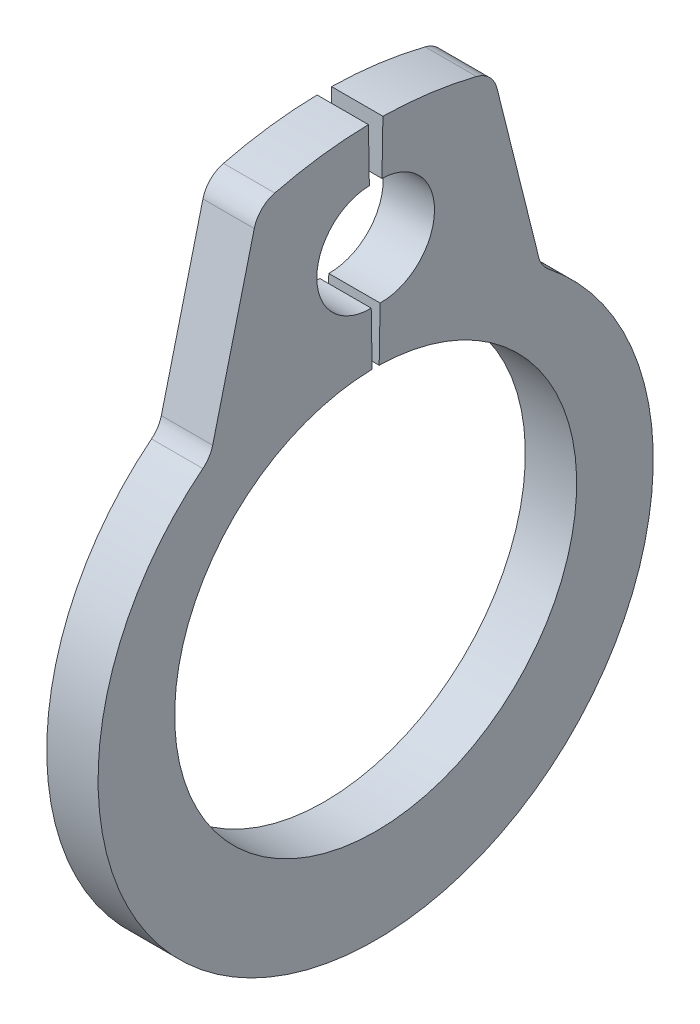
ISO-10303-21;
HEADER;
FILE_DESCRIPTION(('STEP AP214'),'2;1');
FILE_NAME('part.step','',(''),(''),'','','');
FILE_SCHEMA(('AUTOMOTIVE_DESIGN { 1 0 10303 214 1 1 1 1 }'));
ENDSEC;
DATA;
#1=APPLICATION_CONTEXT('core data for automotive mechanical design processes');
#2=APPLICATION_PROTOCOL_DEFINITION('international standard','automotive_design',2000,#1);
#3=PRODUCT_CONTEXT('',#1,'mechanical');
#4=PRODUCT('Part','Part','',(#3));
#5=PRODUCT_RELATED_PRODUCT_CATEGORY('part','',(#4));
#6=PRODUCT_DEFINITION_FORMATION('','',#4);
#7=PRODUCT_DEFINITION_CONTEXT('part definition',#1,'design');
#8=PRODUCT_DEFINITION('design','',#6,#7);
#9=PRODUCT_DEFINITION_SHAPE('','',#8);
#10=(LENGTH_UNIT() NAMED_UNIT(*) SI_UNIT(.MILLI.,.METRE.));
#11=(NAMED_UNIT(*) PLANE_ANGLE_UNIT() SI_UNIT($,.RADIAN.));
#12=(NAMED_UNIT(*) SI_UNIT($,.STERADIAN.) SOLID_ANGLE_UNIT());
#13=UNCERTAINTY_MEASURE_WITH_UNIT(LENGTH_MEASURE(1.E-05),#10,'distance_accuracy_value','');
#14=(GEOMETRIC_REPRESENTATION_CONTEXT(3) GLOBAL_UNCERTAINTY_ASSIGNED_CONTEXT((#13)) GLOBAL_UNIT_ASSIGNED_CONTEXT((#10,
#11,#12)) REPRESENTATION_CONTEXT('',''));
#15=CARTESIAN_POINT('',(0.,0.,0.));
#16=DIRECTION('',(0.,0.,1.));
#17=DIRECTION('',(1.,0.,0.));
#18=AXIS2_PLACEMENT_3D('',#15,#16,#17);
#19=CARTESIAN_POINT('',(0.3,0.,0.));
#20=DIRECTION('',(-1.,0.,0.));
#21=DIRECTION('',(0.,0.,1.));
#22=AXIS2_PLACEMENT_3D('',#19,#20,#21);
#23=CYLINDRICAL_SURFACE('',#22,2.35);
#24=CARTESIAN_POINT('',(-0.3,0.,0.));
#25=DIRECTION('',(-1.,0.,0.));
#26=DIRECTION('',(0.,0.,-1.));
#27=AXIS2_PLACEMENT_3D('',#24,#25,#26);
#28=CIRCLE('',#27,2.35);
#29=CARTESIAN_POINT('',(-0.3,2.34964208361752,-0.0410131551276164));
#30=VERTEX_POINT('',#29);
#31=CARTESIAN_POINT('',(-0.3,2.34964208361752,0.0410131551276164));
#32=VERTEX_POINT('',#31);
#33=EDGE_CURVE('E171',#30,#32,#28,.T.);
#34=ORIENTED_EDGE('',*,*,#33,.T.);
#35=DIRECTION('',(-1.,0.,0.));
#36=VECTOR('',#35,1.);
#37=CARTESIAN_POINT('',(0.3,2.34964208361752,0.0410131551276164));
#38=LINE('',#37,#36);
#39=CARTESIAN_POINT('',(0.3,2.34964208361752,0.0410131551276164));
#40=VERTEX_POINT('',#39);
#41=EDGE_CURVE('E152',#40,#32,#38,.T.);
#42=ORIENTED_EDGE('',*,*,#41,.F.);
#43=CARTESIAN_POINT('',(0.3,0.,0.));
#44=DIRECTION('',(-1.,0.,0.));
#45=DIRECTION('',(0.,0.,-1.));
#46=AXIS2_PLACEMENT_3D('',#43,#44,#45);
#47=CIRCLE('',#46,2.35);
#48=CARTESIAN_POINT('',(0.3,2.34964208361752,-0.0410131551276164));
#49=VERTEX_POINT('',#48);
#50=EDGE_CURVE('E158',#49,#40,#47,.T.);
#51=ORIENTED_EDGE('',*,*,#50,.F.);
#52=DIRECTION('',(-1.,0.,0.));
#53=VECTOR('',#52,1.);
#54=CARTESIAN_POINT('',(0.3,2.34964208361752,-0.0410131551276164));
#55=LINE('',#54,#53);
#56=EDGE_CURVE('E240',#49,#30,#55,.T.);
#57=ORIENTED_EDGE('',*,*,#56,.T.);
#58=EDGE_LOOP('',(#34,#42,#51,#57));
#59=FACE_BOUND('',#58,.T.);
#60=ADVANCED_FACE('F34',(#59),#23,.F.);
#61=CARTESIAN_POINT('',(0.3,2.97454689309026,0.0519209091509186));
#62=DIRECTION('',(0.,-0.0174524064372835,0.999847695156391));
#63=DIRECTION('',(0.,-0.999847695156391,-0.0174524064372835));
#64=AXIS2_PLACEMENT_3D('',#61,#62,#63);
#65=PLANE('',#64);
#66=DIRECTION('',(0.,0.999847695156391,0.0174524064372835));
#67=VECTOR('',#66,1.);
#68=CARTESIAN_POINT('',(-0.3,2.97454689309026,0.0519209091509186));
#69=LINE('',#68,#67);
#70=CARTESIAN_POINT('',(-0.3,2.97454689309026,0.0519209091509186));
#71=VERTEX_POINT('',#70);
#72=EDGE_CURVE('E242',#32,#71,#69,.T.);
#73=ORIENTED_EDGE('',*,*,#72,.T.);
#74=DIRECTION('',(-1.,0.,0.));
#75=VECTOR('',#74,1.);
#76=CARTESIAN_POINT('',(0.3,2.97454689309026,0.0519209091509186));
#77=LINE('',#76,#75);
#78=CARTESIAN_POINT('',(0.3,2.97454689309026,0.0519209091509186));
#79=VERTEX_POINT('',#78);
#80=EDGE_CURVE('E155',#79,#71,#77,.T.);
#81=ORIENTED_EDGE('',*,*,#80,.F.);
#82=DIRECTION('',(0.,0.999847695156391,0.0174524064372835));
#83=VECTOR('',#82,1.);
#84=CARTESIAN_POINT('',(0.3,2.97454689309026,0.0519209091509186));
#85=LINE('',#84,#83);
#86=EDGE_CURVE('E148',#40,#79,#85,.T.);
#87=ORIENTED_EDGE('',*,*,#86,.F.);
#88=ORIENTED_EDGE('',*,*,#41,.T.);
#89=EDGE_LOOP('',(#73,#81,#87,#88));
#90=FACE_BOUND('',#89,.T.);
#91=ADVANCED_FACE('F150',(#90),#65,.F.);
#92=CARTESIAN_POINT('',(0.3,3.59945170256301,0.0628286631742208));
#93=DIRECTION('',(-1.,0.,0.));
#94=DIRECTION('',(0.,0.,1.));
#95=AXIS2_PLACEMENT_3D('',#92,#93,#94);
#96=CYLINDRICAL_SURFACE('',#95,0.625);
#97=CARTESIAN_POINT('',(-0.3,3.59945170256301,0.0628286631742208));
#98=DIRECTION('',(-1.,0.,0.));
#99=DIRECTION('',(0.,0.,1.));
#100=AXIS2_PLACEMENT_3D('',#97,#98,#99);
#101=CIRCLE('',#100,0.625);
#102=CARTESIAN_POINT('',(-0.3,4.22435651203575,0.0737364171975229));
#103=VERTEX_POINT('',#102);
#104=EDGE_CURVE('E244',#71,#103,#101,.T.);
#105=ORIENTED_EDGE('',*,*,#104,.T.);
#106=DIRECTION('',(-1.,0.,0.));
#107=VECTOR('',#106,1.);
#108=CARTESIAN_POINT('',(0.3,4.22435651203575,0.0737364171975229));
#109=LINE('',#108,#107);
#110=CARTESIAN_POINT('',(0.3,4.22435651203575,0.0737364171975229));
#111=VERTEX_POINT('',#110);
#112=EDGE_CURVE('E176',#111,#103,#109,.T.);
#113=ORIENTED_EDGE('',*,*,#112,.F.);
#114=CARTESIAN_POINT('',(0.3,3.59945170256301,0.0628286631742208));
#115=DIRECTION('',(-1.,0.,0.));
#116=DIRECTION('',(0.,0.,1.));
#117=AXIS2_PLACEMENT_3D('',#114,#115,#116);
#118=CIRCLE('',#117,0.625);
#119=EDGE_CURVE('E157',#79,#111,#118,.T.);
#120=ORIENTED_EDGE('',*,*,#119,.F.);
#121=ORIENTED_EDGE('',*,*,#80,.T.);
#122=EDGE_LOOP('',(#105,#113,#120,#121));
#123=FACE_BOUND('',#122,.T.);
#124=ADVANCED_FACE('F302',(#123),#96,.F.);
#125=CARTESIAN_POINT('',(0.3,4.22435651203575,0.073736417197523));
#126=DIRECTION('',(0.,-0.0174524064372835,0.999847695156391));
#127=DIRECTION('',(0.,-0.999847695156391,-0.0174524064372835));
#128=AXIS2_PLACEMENT_3D('',#125,#126,#127);
#129=PLANE('',#128);
#130=DIRECTION('',(0.,0.999847695156391,0.0174524064372835));
#131=VECTOR('',#130,1.);
#132=CARTESIAN_POINT('',(-0.3,4.22435651203575,0.073736417197523));
#133=LINE('',#132,#131);
#134=CARTESIAN_POINT('',(-0.3,4.8492613215085,0.0846441712208252));
#135=VERTEX_POINT('',#134);
#136=EDGE_CURVE('E246',#103,#135,#133,.T.);
#137=ORIENTED_EDGE('',*,*,#136,.T.);
#138=DIRECTION('',(-1.,0.,0.));
#139=VECTOR('',#138,1.);
#140=CARTESIAN_POINT('',(0.3,4.8492613215085,0.0846441712208252));
#141=LINE('',#140,#139);
#142=CARTESIAN_POINT('',(0.3,4.8492613215085,0.0846441712208252));
#143=VERTEX_POINT('',#142);
#144=EDGE_CURVE('E271',#143,#135,#141,.T.);
#145=ORIENTED_EDGE('',*,*,#144,.F.);
#146=DIRECTION('',(0.,0.999847695156391,0.0174524064372835));
#147=VECTOR('',#146,1.);
#148=CARTESIAN_POINT('',(0.3,4.22435651203575,0.073736417197523));
#149=LINE('',#148,#147);
#150=EDGE_CURVE('E280',#111,#143,#149,.T.);
#151=ORIENTED_EDGE('',*,*,#150,.F.);
#152=ORIENTED_EDGE('',*,*,#112,.T.);
#153=EDGE_LOOP('',(#137,#145,#151,#152));
#154=FACE_BOUND('',#153,.T.);
#155=ADVANCED_FACE('F278',(#154),#129,.F.);
#156=CARTESIAN_POINT('',(0.3,0.,0.));
#157=DIRECTION('',(-1.,0.,0.));
#158=DIRECTION('',(0.,0.,1.));
#159=AXIS2_PLACEMENT_3D('',#156,#157,#158);
#160=CYLINDRICAL_SURFACE('',#159,4.85);
#161=CARTESIAN_POINT('',(-0.3,0.,0.));
#162=DIRECTION('',(1.,0.,0.));
#163=DIRECTION('',(0.,0.,-1.));
#164=AXIS2_PLACEMENT_3D('',#161,#162,#163);
#165=CIRCLE('',#164,4.85);
#166=CARTESIAN_POINT('',(-0.3,4.70444072795117,1.1792953138185));
#167=VERTEX_POINT('',#166);
#168=EDGE_CURVE('E248',#135,#167,#165,.T.);
#169=ORIENTED_EDGE('',*,*,#168,.T.);
#170=DIRECTION('',(-1.,0.,0.));
#171=VECTOR('',#170,1.);
#172=CARTESIAN_POINT('',(0.3,4.70444072795117,1.1792953138185));
#173=LINE('',#172,#171);
#174=CARTESIAN_POINT('',(0.3,4.70444072795117,1.1792953138185));
#175=VERTEX_POINT('',#174);
#176=EDGE_CURVE('E191',#167,#175,#173,.F.);
#177=ORIENTED_EDGE('',*,*,#176,.T.);
#178=CARTESIAN_POINT('',(0.3,0.,0.));
#179=DIRECTION('',(1.,0.,0.));
#180=DIRECTION('',(0.,0.,-1.));
#181=AXIS2_PLACEMENT_3D('',#178,#179,#180);
#182=CIRCLE('',#181,4.85);
#183=EDGE_CURVE('E295',#143,#175,#182,.T.);
#184=ORIENTED_EDGE('',*,*,#183,.F.);
#185=ORIENTED_EDGE('',*,*,#144,.T.);
#186=EDGE_LOOP('',(#169,#177,#184,#185));
#187=FACE_BOUND('',#186,.T.);
#188=ADVANCED_FACE('F286',(#187),#160,.T.);
#189=CARTESIAN_POINT('',(0.3,4.65175064164192,1.37248532523449));
#190=DIRECTION('',(0.,-0.241921895599664,-0.970295726275997));
#191=DIRECTION('',(0.,0.970295726275997,-0.241921895599664));
#192=AXIS2_PLACEMENT_3D('',#189,#190,#191);
#193=PLANE('',#192);
#194=DIRECTION('',(0.,-0.970295726275997,0.241921895599664));
#195=VECTOR('',#194,1.);
#196=CARTESIAN_POINT('',(-0.3,4.65175064164192,1.37248532523449));
#197=LINE('',#196,#195);
#198=CARTESIAN_POINT('',(-0.3,4.46417898644259,1.41925219141533));
#199=VERTEX_POINT('',#198);
#200=CARTESIAN_POINT('',(-0.3,2.51344212711307,1.90562551662453));
#201=VERTEX_POINT('',#200);
#202=EDGE_CURVE('E222',#199,#201,#197,.T.);
#203=ORIENTED_EDGE('',*,*,#202,.T.);
#204=DIRECTION('',(1.,0.,0.));
#205=VECTOR('',#204,1.);
#206=CARTESIAN_POINT('',(0.3,2.51344212711307,1.90562551662453));
#207=LINE('',#206,#205);
#208=CARTESIAN_POINT('',(0.3,2.51344212711307,1.90562551662453));
#209=VERTEX_POINT('',#208);
#210=EDGE_CURVE('E185',#201,#209,#207,.T.);
#211=ORIENTED_EDGE('',*,*,#210,.T.);
#212=DIRECTION('',(0.,-0.970295726275997,0.241921895599664));
#213=VECTOR('',#212,1.);
#214=CARTESIAN_POINT('',(0.3,4.65175064164192,1.37248532523449));
#215=LINE('',#214,#213);
#216=CARTESIAN_POINT('',(0.3,4.46417898644259,1.41925219141533));
#217=VERTEX_POINT('',#216);
#218=EDGE_CURVE('E232',#217,#209,#215,.T.);
#219=ORIENTED_EDGE('',*,*,#218,.F.);
#220=DIRECTION('',(-1.,0.,0.));
#221=VECTOR('',#220,1.);
#222=CARTESIAN_POINT('',(0.3,4.46417898644259,1.41925219141533));
#223=LINE('',#222,#221);
#224=EDGE_CURVE('E182',#217,#199,#223,.T.);
#225=ORIENTED_EDGE('',*,*,#224,.T.);
#226=EDGE_LOOP('',(#203,#211,#219,#225));
#227=FACE_BOUND('',#226,.T.);
#228=ADVANCED_FACE('F297',(#227),#193,.F.);
#229=CARTESIAN_POINT('',(0.3,-0.204685087688119,0.));
#230=DIRECTION('',(-1.,0.,0.));
#231=DIRECTION('',(0.,0.,1.));
#232=AXIS2_PLACEMENT_3D('',#229,#230,#231);
#233=CYLINDRICAL_SURFACE('',#232,3.24531491231188);
#234=CARTESIAN_POINT('',(0.3,-0.204685087688119,0.));
#235=DIRECTION('',(1.,0.,0.));
#236=DIRECTION('',(0.,0.,-1.));
#237=AXIS2_PLACEMENT_3D('',#234,#235,#236);
#238=CIRCLE('',#237,3.24531491231188);
#239=CARTESIAN_POINT('',(0.3,2.33502573755132,2.02038060875555));
#240=VERTEX_POINT('',#239);
#241=CARTESIAN_POINT('',(0.3,2.33502573755133,-2.02038060875555));
#242=VERTEX_POINT('',#241);
#243=EDGE_CURVE('E226',#240,#242,#238,.T.);
#244=ORIENTED_EDGE('',*,*,#243,.F.);
#245=DIRECTION('',(-1.,0.,0.));
#246=VECTOR('',#245,1.);
#247=CARTESIAN_POINT('',(0.3,2.33502573755132,2.02038060875555));
#248=LINE('',#247,#246);
#249=CARTESIAN_POINT('',(-0.3,2.33502573755132,2.02038060875555));
#250=VERTEX_POINT('',#249);
#251=EDGE_CURVE('E174',#240,#250,#248,.T.);
#252=ORIENTED_EDGE('',*,*,#251,.T.);
#253=CARTESIAN_POINT('',(-0.3,-0.204685087688119,0.));
#254=DIRECTION('',(1.,0.,0.));
#255=DIRECTION('',(0.,0.,-1.));
#256=AXIS2_PLACEMENT_3D('',#253,#254,#255);
#257=CIRCLE('',#256,3.24531491231188);
#258=CARTESIAN_POINT('',(-0.3,2.33502573755133,-2.02038060875555));
#259=VERTEX_POINT('',#258);
#260=EDGE_CURVE('E212',#250,#259,#257,.T.);
#261=ORIENTED_EDGE('',*,*,#260,.T.);
#262=DIRECTION('',(-1.,0.,0.));
#263=VECTOR('',#262,1.);
#264=CARTESIAN_POINT('',(0.3,2.33502573755133,-2.02038060875555));
#265=LINE('',#264,#263);
#266=EDGE_CURVE('E172',#259,#242,#265,.F.);
#267=ORIENTED_EDGE('',*,*,#266,.T.);
#268=EDGE_LOOP('',(#244,#252,#261,#267));
#269=FACE_BOUND('',#268,.T.);
#270=ADVANCED_FACE('F219',(#269),#233,.T.);
#271=CARTESIAN_POINT('',(0.3,4.65175064164193,-1.37248532523449));
#272=DIRECTION('',(0.,-0.241921895599662,0.970295726275998));
#273=DIRECTION('',(0.,-0.970295726275998,-0.241921895599662));
#274=AXIS2_PLACEMENT_3D('',#271,#272,#273);
#275=PLANE('',#274);
#276=DIRECTION('',(0.,0.970295726275998,0.241921895599662));
#277=VECTOR('',#276,1.);
#278=CARTESIAN_POINT('',(-0.3,4.65175064164193,-1.37248532523449));
#279=LINE('',#278,#277);
#280=CARTESIAN_POINT('',(-0.3,2.51344212711308,-1.90562551662452));
#281=VERTEX_POINT('',#280);
#282=CARTESIAN_POINT('',(-0.3,4.4641789864426,-1.41925219141532));
#283=VERTEX_POINT('',#282);
#284=EDGE_CURVE('E213',#281,#283,#279,.T.);
#285=ORIENTED_EDGE('',*,*,#284,.T.);
#286=DIRECTION('',(-1.,0.,0.));
#287=VECTOR('',#286,1.);
#288=CARTESIAN_POINT('',(0.3,4.4641789864426,-1.41925219141532));
#289=LINE('',#288,#287);
#290=CARTESIAN_POINT('',(0.3,4.4641789864426,-1.41925219141532));
#291=VERTEX_POINT('',#290);
#292=EDGE_CURVE('E57',#283,#291,#289,.F.);
#293=ORIENTED_EDGE('',*,*,#292,.T.);
#294=DIRECTION('',(0.,0.970295726275998,0.241921895599662));
#295=VECTOR('',#294,1.);
#296=CARTESIAN_POINT('',(0.3,4.65175064164193,-1.37248532523449));
#297=LINE('',#296,#295);
#298=CARTESIAN_POINT('',(0.3,2.51344212711308,-1.90562551662452));
#299=VERTEX_POINT('',#298);
#300=EDGE_CURVE('E225',#299,#291,#297,.T.);
#301=ORIENTED_EDGE('',*,*,#300,.F.);
#302=DIRECTION('',(1.,0.,0.));
#303=VECTOR('',#302,1.);
#304=CARTESIAN_POINT('',(-0.3,2.51344212711308,-1.90562551662452));
#305=LINE('',#304,#303);
#306=EDGE_CURVE('E199',#299,#281,#305,.F.);
#307=ORIENTED_EDGE('',*,*,#306,.T.);
#308=EDGE_LOOP('',(#285,#293,#301,#307));
#309=FACE_BOUND('',#308,.T.);
#310=ADVANCED_FACE('F227',(#309),#275,.F.);
#311=CARTESIAN_POINT('',(0.3,0.,0.));
#312=DIRECTION('',(-1.,0.,0.));
#313=DIRECTION('',(0.,0.,1.));
#314=AXIS2_PLACEMENT_3D('',#311,#312,#313);
#315=CYLINDRICAL_SURFACE('',#314,4.85000000000001);
#316=CARTESIAN_POINT('',(0.3,0.,0.));
#317=DIRECTION('',(1.,0.,0.));
#318=DIRECTION('',(0.,0.,1.));
#319=AXIS2_PLACEMENT_3D('',#316,#317,#318);
#320=CIRCLE('',#319,4.85000000000001);
#321=CARTESIAN_POINT('',(0.3,4.70444072795118,-1.17929531381849));
#322=VERTEX_POINT('',#321);
#323=CARTESIAN_POINT('',(0.3,4.84926132150851,-0.084644171220825));
#324=VERTEX_POINT('',#323);
#325=EDGE_CURVE('E228',#322,#324,#320,.T.);
#326=ORIENTED_EDGE('',*,*,#325,.F.);
#327=DIRECTION('',(-1.,0.,0.));
#328=VECTOR('',#327,1.);
#329=CARTESIAN_POINT('',(0.3,4.70444072795118,-1.17929531381849));
#330=LINE('',#329,#328);
#331=CARTESIAN_POINT('',(-0.3,4.70444072795118,-1.17929531381849));
#332=VERTEX_POINT('',#331);
#333=EDGE_CURVE('E196',#322,#332,#330,.T.);
#334=ORIENTED_EDGE('',*,*,#333,.T.);
#335=CARTESIAN_POINT('',(-0.3,0.,0.));
#336=DIRECTION('',(1.,0.,0.));
#337=DIRECTION('',(0.,0.,1.));
#338=AXIS2_PLACEMENT_3D('',#335,#336,#337);
#339=CIRCLE('',#338,4.85000000000001);
#340=CARTESIAN_POINT('',(-0.3,4.84926132150851,-0.084644171220825));
#341=VERTEX_POINT('',#340);
#342=EDGE_CURVE('E254',#332,#341,#339,.T.);
#343=ORIENTED_EDGE('',*,*,#342,.T.);
#344=DIRECTION('',(-1.,0.,0.));
#345=VECTOR('',#344,1.);
#346=CARTESIAN_POINT('',(0.3,4.84926132150851,-0.084644171220825));
#347=LINE('',#346,#345);
#348=EDGE_CURVE('E268',#324,#341,#347,.T.);
#349=ORIENTED_EDGE('',*,*,#348,.F.);
#350=EDGE_LOOP('',(#326,#334,#343,#349));
#351=FACE_BOUND('',#350,.T.);
#352=ADVANCED_FACE('F330',(#351),#315,.T.);
#353=CARTESIAN_POINT('',(0.3,4.22435651203576,-0.0737364171975228));
#354=DIRECTION('',(0.,-0.0174524064372835,-0.999847695156391));
#355=DIRECTION('',(0.,0.999847695156391,-0.0174524064372835));
#356=AXIS2_PLACEMENT_3D('',#353,#354,#355);
#357=PLANE('',#356);
#358=DIRECTION('',(0.,-0.999847695156391,0.0174524064372835));
#359=VECTOR('',#358,1.);
#360=CARTESIAN_POINT('',(-0.3,4.22435651203576,-0.0737364171975228));
#361=LINE('',#360,#359);
#362=CARTESIAN_POINT('',(-0.3,4.22435651203576,-0.0737364171975228));
#363=VERTEX_POINT('',#362);
#364=EDGE_CURVE('E256',#341,#363,#361,.T.);
#365=ORIENTED_EDGE('',*,*,#364,.T.);
#366=DIRECTION('',(-1.,0.,0.));
#367=VECTOR('',#366,1.);
#368=CARTESIAN_POINT('',(0.3,4.22435651203576,-0.0737364171975228));
#369=LINE('',#368,#367);
#370=CARTESIAN_POINT('',(0.3,4.22435651203576,-0.0737364171975228));
#371=VERTEX_POINT('',#370);
#372=EDGE_CURVE('E265',#371,#363,#369,.T.);
#373=ORIENTED_EDGE('',*,*,#372,.F.);
#374=DIRECTION('',(0.,-0.999847695156391,0.0174524064372835));
#375=VECTOR('',#374,1.);
#376=CARTESIAN_POINT('',(0.3,4.22435651203576,-0.0737364171975228));
#377=LINE('',#376,#375);
#378=EDGE_CURVE('E230',#324,#371,#377,.T.);
#379=ORIENTED_EDGE('',*,*,#378,.F.);
#380=ORIENTED_EDGE('',*,*,#348,.T.);
#381=EDGE_LOOP('',(#365,#373,#379,#380));
#382=FACE_BOUND('',#381,.T.);
#383=ADVANCED_FACE('F337',(#382),#357,.F.);
#384=CARTESIAN_POINT('',(0.3,3.59945170256301,-0.0628286631742206));
#385=DIRECTION('',(-1.,0.,0.));
#386=DIRECTION('',(0.,0.,1.));
#387=AXIS2_PLACEMENT_3D('',#384,#385,#386);
#388=CYLINDRICAL_SURFACE('',#387,0.625);
#389=CARTESIAN_POINT('',(-0.3,3.59945170256301,-0.0628286631742206));
#390=DIRECTION('',(-1.,0.,0.));
#391=DIRECTION('',(0.,0.,1.));
#392=AXIS2_PLACEMENT_3D('',#389,#390,#391);
#393=CIRCLE('',#392,0.625);
#394=CARTESIAN_POINT('',(-0.3,2.97454689309027,-0.0519209091509186));
#395=VERTEX_POINT('',#394);
#396=EDGE_CURVE('E258',#363,#395,#393,.T.);
#397=ORIENTED_EDGE('',*,*,#396,.T.);
#398=DIRECTION('',(-1.,0.,0.));
#399=VECTOR('',#398,1.);
#400=CARTESIAN_POINT('',(0.3,2.97454689309027,-0.0519209091509186));
#401=LINE('',#400,#399);
#402=CARTESIAN_POINT('',(0.3,2.97454689309027,-0.0519209091509186));
#403=VERTEX_POINT('',#402);
#404=EDGE_CURVE('E262',#403,#395,#401,.T.);
#405=ORIENTED_EDGE('',*,*,#404,.F.);
#406=CARTESIAN_POINT('',(0.3,3.59945170256301,-0.0628286631742206));
#407=DIRECTION('',(-1.,0.,0.));
#408=DIRECTION('',(0.,0.,1.));
#409=AXIS2_PLACEMENT_3D('',#406,#407,#408);
#410=CIRCLE('',#409,0.625);
#411=EDGE_CURVE('E237',#371,#403,#410,.T.);
#412=ORIENTED_EDGE('',*,*,#411,.F.);
#413=ORIENTED_EDGE('',*,*,#372,.T.);
#414=EDGE_LOOP('',(#397,#405,#412,#413));
#415=FACE_BOUND('',#414,.T.);
#416=ADVANCED_FACE('F341',(#415),#388,.F.);
#417=CARTESIAN_POINT('',(0.3,2.34964208361752,-0.0410131551276164));
#418=DIRECTION('',(0.,-0.0174524064372832,-0.999847695156391));
#419=DIRECTION('',(0.,0.999847695156391,-0.0174524064372832));
#420=AXIS2_PLACEMENT_3D('',#417,#418,#419);
#421=PLANE('',#420);
#422=DIRECTION('',(0.,-0.999847695156391,0.0174524064372832));
#423=VECTOR('',#422,1.);
#424=CARTESIAN_POINT('',(-0.3,2.34964208361752,-0.0410131551276164));
#425=LINE('',#424,#423);
#426=EDGE_CURVE('E168',#395,#30,#425,.T.);
#427=ORIENTED_EDGE('',*,*,#426,.T.);
#428=ORIENTED_EDGE('',*,*,#56,.F.);
#429=DIRECTION('',(0.,-0.999847695156391,0.0174524064372832));
#430=VECTOR('',#429,1.);
#431=CARTESIAN_POINT('',(0.3,2.34964208361752,-0.0410131551276164));
#432=LINE('',#431,#430);
#433=EDGE_CURVE('E164',#403,#49,#432,.T.);
#434=ORIENTED_EDGE('',*,*,#433,.F.);
#435=ORIENTED_EDGE('',*,*,#404,.T.);
#436=EDGE_LOOP('',(#427,#428,#434,#435));
#437=FACE_BOUND('',#436,.T.);
#438=ADVANCED_FACE('F344',(#437),#421,.F.);
#439=CARTESIAN_POINT('',(0.3,0.,0.));
#440=DIRECTION('',(1.,0.,0.));
#441=DIRECTION('',(0.,0.,-1.));
#442=AXIS2_PLACEMENT_3D('',#439,#440,#441);
#443=PLANE('',#442);
#444=ORIENTED_EDGE('',*,*,#183,.T.);
#445=CARTESIAN_POINT('',(0.3,4.3843447608947,1.09905460174425));
#446=DIRECTION('',(1.,0.,0.));
#447=DIRECTION('',(0.,0.,-1.));
#448=AXIS2_PLACEMENT_3D('',#445,#446,#447);
#449=CIRCLE('',#448,0.33);
#450=EDGE_CURVE('E194',#175,#217,#449,.T.);
#451=ORIENTED_EDGE('',*,*,#450,.T.);
#452=ORIENTED_EDGE('',*,*,#218,.T.);
#453=CARTESIAN_POINT('',(0.3,2.59327635266096,2.22582310629561));
#454=DIRECTION('',(1.,0.,0.));
#455=DIRECTION('',(0.,0.,-1.));
#456=AXIS2_PLACEMENT_3D('',#453,#454,#455);
#457=CIRCLE('',#456,0.33);
#458=EDGE_CURVE('E205',#209,#240,#457,.F.);
#459=ORIENTED_EDGE('',*,*,#458,.T.);
#460=ORIENTED_EDGE('',*,*,#243,.T.);
#461=CARTESIAN_POINT('',(0.3,2.59327635266096,-2.2258231062956));
#462=DIRECTION('',(1.,0.,0.));
#463=DIRECTION('',(0.,0.,-1.));
#464=AXIS2_PLACEMENT_3D('',#461,#462,#463);
#465=CIRCLE('',#464,0.33);
#466=EDGE_CURVE('E11',#242,#299,#465,.F.);
#467=ORIENTED_EDGE('',*,*,#466,.T.);
#468=ORIENTED_EDGE('',*,*,#300,.T.);
#469=CARTESIAN_POINT('',(0.3,4.38434476089471,-1.09905460174425));
#470=DIRECTION('',(1.,0.,0.));
#471=DIRECTION('',(0.,0.,-1.));
#472=AXIS2_PLACEMENT_3D('',#469,#470,#471);
#473=CIRCLE('',#472,0.33);
#474=EDGE_CURVE('E49',#291,#322,#473,.T.);
#475=ORIENTED_EDGE('',*,*,#474,.T.);
#476=ORIENTED_EDGE('',*,*,#325,.T.);
#477=ORIENTED_EDGE('',*,*,#378,.T.);
#478=ORIENTED_EDGE('',*,*,#411,.T.);
#479=ORIENTED_EDGE('',*,*,#433,.T.);
#480=ORIENTED_EDGE('',*,*,#50,.T.);
#481=ORIENTED_EDGE('',*,*,#86,.T.);
#482=ORIENTED_EDGE('',*,*,#119,.T.);
#483=ORIENTED_EDGE('',*,*,#150,.T.);
#484=EDGE_LOOP('',(#444,#451,#452,#459,#460,#467,#468,#475,#476,#477,#478,#479,#480,#481,#482,#483));
#485=FACE_BOUND('',#484,.T.);
#486=ADVANCED_FACE('F162',(#485),#443,.T.);
#487=CARTESIAN_POINT('',(-0.3,0.,0.));
#488=DIRECTION('',(1.,0.,0.));
#489=DIRECTION('',(0.,0.,-1.));
#490=AXIS2_PLACEMENT_3D('',#487,#488,#489);
#491=PLANE('',#490);
#492=ORIENTED_EDGE('',*,*,#202,.F.);
#493=CARTESIAN_POINT('',(-0.3,4.3843447608947,1.09905460174425));
#494=DIRECTION('',(1.,0.,0.));
#495=DIRECTION('',(0.,0.,-1.));
#496=AXIS2_PLACEMENT_3D('',#493,#494,#495);
#497=CIRCLE('',#496,0.33);
#498=EDGE_CURVE('E189',#199,#167,#497,.F.);
#499=ORIENTED_EDGE('',*,*,#498,.T.);
#500=ORIENTED_EDGE('',*,*,#168,.F.);
#501=ORIENTED_EDGE('',*,*,#136,.F.);
#502=ORIENTED_EDGE('',*,*,#104,.F.);
#503=ORIENTED_EDGE('',*,*,#72,.F.);
#504=ORIENTED_EDGE('',*,*,#33,.F.);
#505=ORIENTED_EDGE('',*,*,#426,.F.);
#506=ORIENTED_EDGE('',*,*,#396,.F.);
#507=ORIENTED_EDGE('',*,*,#364,.F.);
#508=ORIENTED_EDGE('',*,*,#342,.F.);
#509=CARTESIAN_POINT('',(-0.3,4.38434476089471,-1.09905460174425));
#510=DIRECTION('',(1.,0.,0.));
#511=DIRECTION('',(0.,0.,-1.));
#512=AXIS2_PLACEMENT_3D('',#509,#510,#511);
#513=CIRCLE('',#512,0.33);
#514=EDGE_CURVE('E187',#332,#283,#513,.F.);
#515=ORIENTED_EDGE('',*,*,#514,.T.);
#516=ORIENTED_EDGE('',*,*,#284,.F.);
#517=CARTESIAN_POINT('',(-0.3,2.59327635266096,-2.2258231062956));
#518=DIRECTION('',(1.,0.,0.));
#519=DIRECTION('',(0.,0.,-1.));
#520=AXIS2_PLACEMENT_3D('',#517,#518,#519);
#521=CIRCLE('',#520,0.33);
#522=EDGE_CURVE('E42',#281,#259,#521,.T.);
#523=ORIENTED_EDGE('',*,*,#522,.T.);
#524=ORIENTED_EDGE('',*,*,#260,.F.);
#525=CARTESIAN_POINT('',(-0.3,2.59327635266096,2.22582310629561));
#526=DIRECTION('',(1.,0.,0.));
#527=DIRECTION('',(0.,0.,-1.));
#528=AXIS2_PLACEMENT_3D('',#525,#526,#527);
#529=CIRCLE('',#528,0.33);
#530=EDGE_CURVE('E203',#250,#201,#529,.T.);
#531=ORIENTED_EDGE('',*,*,#530,.T.);
#532=EDGE_LOOP('',(#492,#499,#500,#501,#502,#503,#504,#505,#506,#507,#508,#515,#516,#523,#524,#531));
#533=FACE_BOUND('',#532,.T.);
#534=ADVANCED_FACE('F211',(#533),#491,.F.);
#535=CARTESIAN_POINT('',(0.3,2.59327635266096,2.22582310629561));
#536=DIRECTION('',(-1.,0.,0.));
#537=DIRECTION('',(0.,0.,1.));
#538=AXIS2_PLACEMENT_3D('',#535,#536,#537);
#539=CYLINDRICAL_SURFACE('',#538,0.33);
#540=ORIENTED_EDGE('',*,*,#458,.F.);
#541=ORIENTED_EDGE('',*,*,#210,.F.);
#542=ORIENTED_EDGE('',*,*,#530,.F.);
#543=ORIENTED_EDGE('',*,*,#251,.F.);
#544=EDGE_LOOP('',(#540,#541,#542,#543));
#545=FACE_BOUND('',#544,.T.);
#546=ADVANCED_FACE('F316',(#545),#539,.F.);
#547=CARTESIAN_POINT('',(0.3,4.3843447608947,1.09905460174425));
#548=DIRECTION('',(-1.,0.,0.));
#549=DIRECTION('',(0.,0.,1.));
#550=AXIS2_PLACEMENT_3D('',#547,#548,#549);
#551=CYLINDRICAL_SURFACE('',#550,0.33);
#552=ORIENTED_EDGE('',*,*,#450,.F.);
#553=ORIENTED_EDGE('',*,*,#176,.F.);
#554=ORIENTED_EDGE('',*,*,#498,.F.);
#555=ORIENTED_EDGE('',*,*,#224,.F.);
#556=EDGE_LOOP('',(#552,#553,#554,#555));
#557=FACE_BOUND('',#556,.T.);
#558=ADVANCED_FACE('F290',(#557),#551,.T.);
#559=CARTESIAN_POINT('',(0.3,4.38434476089471,-1.09905460174425));
#560=DIRECTION('',(-1.,0.,0.));
#561=DIRECTION('',(0.,0.,1.));
#562=AXIS2_PLACEMENT_3D('',#559,#560,#561);
#563=CYLINDRICAL_SURFACE('',#562,0.33);
#564=ORIENTED_EDGE('',*,*,#474,.F.);
#565=ORIENTED_EDGE('',*,*,#292,.F.);
#566=ORIENTED_EDGE('',*,*,#514,.F.);
#567=ORIENTED_EDGE('',*,*,#333,.F.);
#568=EDGE_LOOP('',(#564,#565,#566,#567));
#569=FACE_BOUND('',#568,.T.);
#570=ADVANCED_FACE('F321',(#569),#563,.T.);
#571=CARTESIAN_POINT('',(0.3,2.59327635266096,-2.2258231062956));
#572=DIRECTION('',(-1.,0.,0.));
#573=DIRECTION('',(0.,0.,1.));
#574=AXIS2_PLACEMENT_3D('',#571,#572,#573);
#575=CYLINDRICAL_SURFACE('',#574,0.33);
#576=ORIENTED_EDGE('',*,*,#466,.F.);
#577=ORIENTED_EDGE('',*,*,#266,.F.);
#578=ORIENTED_EDGE('',*,*,#522,.F.);
#579=ORIENTED_EDGE('',*,*,#306,.F.);
#580=EDGE_LOOP('',(#576,#577,#578,#579));
#581=FACE_BOUND('',#580,.T.);
#582=ADVANCED_FACE('F36',(#581),#575,.F.);
#583=CLOSED_SHELL('',(#60,#91,#124,#155,#188,#228,#270,#310,#352,#383,#416,#438,#486,#534,#546,
#558,#570,#582));
#584=MANIFOLD_SOLID_BREP('B2',#583);
#585=ADVANCED_BREP_SHAPE_REPRESENTATION('',(#18,#584),#14);
#586=SHAPE_DEFINITION_REPRESENTATION(#9,#585);
ENDSEC;
END-ISO-10303-21;
